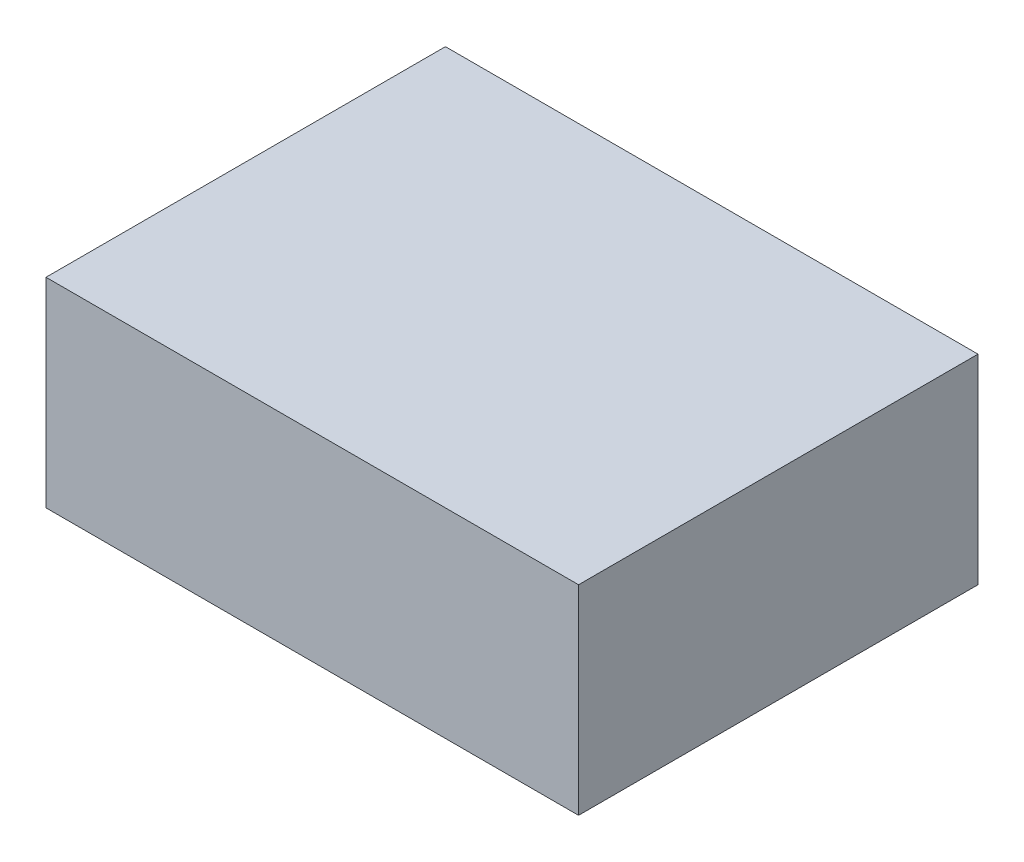
ISO-10303-21;
HEADER;
FILE_DESCRIPTION(('STEP AP214'),'2;1');
FILE_NAME('part.step','',(''),(''),'','','');
FILE_SCHEMA(('AUTOMOTIVE_DESIGN { 1 0 10303 214 1 1 1 1 }'));
ENDSEC;
DATA;
#1=APPLICATION_CONTEXT('core data for automotive mechanical design processes');
#2=APPLICATION_PROTOCOL_DEFINITION('international standard','automotive_design',2000,#1);
#3=PRODUCT_CONTEXT('',#1,'mechanical');
#4=PRODUCT('Part','Part','',(#3));
#5=PRODUCT_RELATED_PRODUCT_CATEGORY('part','',(#4));
#6=PRODUCT_DEFINITION_FORMATION('','',#4);
#7=PRODUCT_DEFINITION_CONTEXT('part definition',#1,'design');
#8=PRODUCT_DEFINITION('design','',#6,#7);
#9=PRODUCT_DEFINITION_SHAPE('','',#8);
#10=(LENGTH_UNIT() NAMED_UNIT(*) SI_UNIT(.MILLI.,.METRE.));
#11=(NAMED_UNIT(*) PLANE_ANGLE_UNIT() SI_UNIT($,.RADIAN.));
#12=(NAMED_UNIT(*) SI_UNIT($,.STERADIAN.) SOLID_ANGLE_UNIT());
#13=UNCERTAINTY_MEASURE_WITH_UNIT(LENGTH_MEASURE(1.E-05),#10,'distance_accuracy_value','');
#14=(GEOMETRIC_REPRESENTATION_CONTEXT(3) GLOBAL_UNCERTAINTY_ASSIGNED_CONTEXT((#13)) GLOBAL_UNIT_ASSIGNED_CONTEXT((#10,
#11,#12)) REPRESENTATION_CONTEXT('',''));
#15=CARTESIAN_POINT('',(0.,0.,0.));
#16=DIRECTION('',(0.,0.,1.));
#17=DIRECTION('',(1.,0.,0.));
#18=AXIS2_PLACEMENT_3D('',#15,#16,#17);
#19=CARTESIAN_POINT('',(-50.8,38.1,-38.1));
#20=DIRECTION('',(0.,0.,-1.));
#21=DIRECTION('',(-1.,0.,0.));
#22=AXIS2_PLACEMENT_3D('',#19,#20,#21);
#23=PLANE('',#22);
#24=DIRECTION('',(1.,0.,0.));
#25=VECTOR('',#24,1.);
#26=CARTESIAN_POINT('',(-50.8,0.,-38.1));
#27=LINE('',#26,#25);
#28=CARTESIAN_POINT('',(-50.8,0.,-38.1));
#29=VERTEX_POINT('',#28);
#30=CARTESIAN_POINT('',(50.8,0.,-38.1));
#31=VERTEX_POINT('',#30);
#32=EDGE_CURVE('E97',#29,#31,#27,.T.);
#33=ORIENTED_EDGE('',*,*,#32,.F.);
#34=DIRECTION('',(0.,-1.,0.));
#35=VECTOR('',#34,1.);
#36=CARTESIAN_POINT('',(-50.8,38.1,-38.1));
#37=LINE('',#36,#35);
#38=CARTESIAN_POINT('',(-50.8,38.1,-38.1));
#39=VERTEX_POINT('',#38);
#40=EDGE_CURVE('E11',#39,#29,#37,.T.);
#41=ORIENTED_EDGE('',*,*,#40,.F.);
#42=DIRECTION('',(1.,0.,0.));
#43=VECTOR('',#42,1.);
#44=CARTESIAN_POINT('',(-50.8,38.1,-38.1));
#45=LINE('',#44,#43);
#46=CARTESIAN_POINT('',(50.8,38.1,-38.1));
#47=VERTEX_POINT('',#46);
#48=EDGE_CURVE('E92',#39,#47,#45,.T.);
#49=ORIENTED_EDGE('',*,*,#48,.T.);
#50=DIRECTION('',(0.,-1.,0.));
#51=VECTOR('',#50,1.);
#52=CARTESIAN_POINT('',(50.8,38.1,-38.1));
#53=LINE('',#52,#51);
#54=EDGE_CURVE('E35',#47,#31,#53,.T.);
#55=ORIENTED_EDGE('',*,*,#54,.T.);
#56=EDGE_LOOP('',(#33,#41,#49,#55));
#57=FACE_BOUND('',#56,.T.);
#58=ADVANCED_FACE('F32',(#57),#23,.T.);
#59=CARTESIAN_POINT('',(-50.8,38.1,-38.1));
#60=DIRECTION('',(1.,0.,0.));
#61=DIRECTION('',(0.,0.,-1.));
#62=AXIS2_PLACEMENT_3D('',#59,#60,#61);
#63=PLANE('',#62);
#64=DIRECTION('',(0.,0.,1.));
#65=VECTOR('',#64,1.);
#66=CARTESIAN_POINT('',(-50.8,0.,-38.1));
#67=LINE('',#66,#65);
#68=CARTESIAN_POINT('',(-50.8,0.,38.1));
#69=VERTEX_POINT('',#68);
#70=EDGE_CURVE('E65',#29,#69,#67,.T.);
#71=ORIENTED_EDGE('',*,*,#70,.T.);
#72=DIRECTION('',(0.,-1.,0.));
#73=VECTOR('',#72,1.);
#74=CARTESIAN_POINT('',(-50.8,38.1,38.1));
#75=LINE('',#74,#73);
#76=CARTESIAN_POINT('',(-50.8,38.1,38.1));
#77=VERTEX_POINT('',#76);
#78=EDGE_CURVE('E41',#77,#69,#75,.T.);
#79=ORIENTED_EDGE('',*,*,#78,.F.);
#80=DIRECTION('',(0.,0.,1.));
#81=VECTOR('',#80,1.);
#82=CARTESIAN_POINT('',(-50.8,38.1,-38.1));
#83=LINE('',#82,#81);
#84=EDGE_CURVE('E82',#39,#77,#83,.T.);
#85=ORIENTED_EDGE('',*,*,#84,.F.);
#86=ORIENTED_EDGE('',*,*,#40,.T.);
#87=EDGE_LOOP('',(#71,#79,#85,#86));
#88=FACE_BOUND('',#87,.T.);
#89=ADVANCED_FACE('F107',(#88),#63,.F.);
#90=CARTESIAN_POINT('',(-50.8,38.1,38.1));
#91=DIRECTION('',(0.,0.,-1.));
#92=DIRECTION('',(-1.,0.,0.));
#93=AXIS2_PLACEMENT_3D('',#90,#91,#92);
#94=PLANE('',#93);
#95=DIRECTION('',(1.,0.,0.));
#96=VECTOR('',#95,1.);
#97=CARTESIAN_POINT('',(-50.8,0.,38.1));
#98=LINE('',#97,#96);
#99=CARTESIAN_POINT('',(50.8,0.,38.1));
#100=VERTEX_POINT('',#99);
#101=EDGE_CURVE('E89',#69,#100,#98,.T.);
#102=ORIENTED_EDGE('',*,*,#101,.T.);
#103=DIRECTION('',(0.,-1.,0.));
#104=VECTOR('',#103,1.);
#105=CARTESIAN_POINT('',(50.8,38.1,38.1));
#106=LINE('',#105,#104);
#107=CARTESIAN_POINT('',(50.8,38.1,38.1));
#108=VERTEX_POINT('',#107);
#109=EDGE_CURVE('E86',#108,#100,#106,.T.);
#110=ORIENTED_EDGE('',*,*,#109,.F.);
#111=DIRECTION('',(1.,0.,0.));
#112=VECTOR('',#111,1.);
#113=CARTESIAN_POINT('',(-50.8,38.1,38.1));
#114=LINE('',#113,#112);
#115=EDGE_CURVE('E77',#77,#108,#114,.T.);
#116=ORIENTED_EDGE('',*,*,#115,.F.);
#117=ORIENTED_EDGE('',*,*,#78,.T.);
#118=EDGE_LOOP('',(#102,#110,#116,#117));
#119=FACE_BOUND('',#118,.T.);
#120=ADVANCED_FACE('F87',(#119),#94,.F.);
#121=CARTESIAN_POINT('',(50.8,38.1,-38.1));
#122=DIRECTION('',(1.,0.,0.));
#123=DIRECTION('',(0.,0.,-1.));
#124=AXIS2_PLACEMENT_3D('',#121,#122,#123);
#125=PLANE('',#124);
#126=DIRECTION('',(0.,0.,1.));
#127=VECTOR('',#126,1.);
#128=CARTESIAN_POINT('',(50.8,0.,-38.1));
#129=LINE('',#128,#127);
#130=EDGE_CURVE('E100',#31,#100,#129,.T.);
#131=ORIENTED_EDGE('',*,*,#130,.F.);
#132=ORIENTED_EDGE('',*,*,#54,.F.);
#133=DIRECTION('',(0.,0.,1.));
#134=VECTOR('',#133,1.);
#135=CARTESIAN_POINT('',(50.8,38.1,-38.1));
#136=LINE('',#135,#134);
#137=EDGE_CURVE('E81',#47,#108,#136,.T.);
#138=ORIENTED_EDGE('',*,*,#137,.T.);
#139=ORIENTED_EDGE('',*,*,#109,.T.);
#140=EDGE_LOOP('',(#131,#132,#138,#139));
#141=FACE_BOUND('',#140,.T.);
#142=ADVANCED_FACE('F91',(#141),#125,.T.);
#143=CARTESIAN_POINT('',(0.,38.1,0.));
#144=DIRECTION('',(0.,-1.,0.));
#145=DIRECTION('',(0.,0.,-1.));
#146=AXIS2_PLACEMENT_3D('',#143,#144,#145);
#147=PLANE('',#146);
#148=ORIENTED_EDGE('',*,*,#48,.F.);
#149=ORIENTED_EDGE('',*,*,#84,.T.);
#150=ORIENTED_EDGE('',*,*,#115,.T.);
#151=ORIENTED_EDGE('',*,*,#137,.F.);
#152=EDGE_LOOP('',(#148,#149,#150,#151));
#153=FACE_BOUND('',#152,.T.);
#154=ADVANCED_FACE('F80',(#153),#147,.F.);
#155=CARTESIAN_POINT('',(0.,0.,0.));
#156=DIRECTION('',(0.,-1.,0.));
#157=DIRECTION('',(0.,0.,-1.));
#158=AXIS2_PLACEMENT_3D('',#155,#156,#157);
#159=PLANE('',#158);
#160=ORIENTED_EDGE('',*,*,#32,.T.);
#161=ORIENTED_EDGE('',*,*,#130,.T.);
#162=ORIENTED_EDGE('',*,*,#101,.F.);
#163=ORIENTED_EDGE('',*,*,#70,.F.);
#164=EDGE_LOOP('',(#160,#161,#162,#163));
#165=FACE_BOUND('',#164,.T.);
#166=ADVANCED_FACE('F105',(#165),#159,.T.);
#167=CLOSED_SHELL('',(#58,#89,#120,#142,#154,#166));
#168=MANIFOLD_SOLID_BREP('B2',#167);
#169=ADVANCED_BREP_SHAPE_REPRESENTATION('',(#18,#168),#14);
#170=SHAPE_DEFINITION_REPRESENTATION(#9,#169);
ENDSEC;
END-ISO-10303-21;
